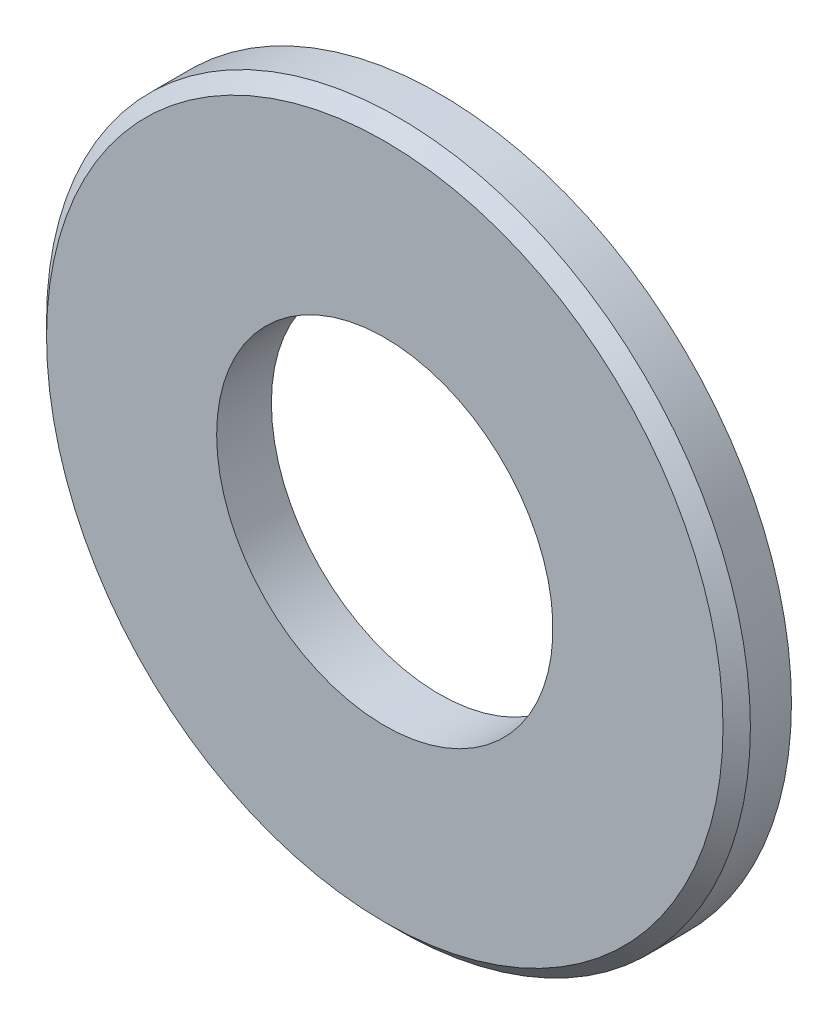
ISO-10303-21;
HEADER;
FILE_DESCRIPTION(('STEP AP214'),'2;1');
FILE_NAME('part.step','',(''),(''),'','','');
FILE_SCHEMA(('AUTOMOTIVE_DESIGN { 1 0 10303 214 1 1 1 1 }'));
ENDSEC;
DATA;
#1=APPLICATION_CONTEXT('core data for automotive mechanical design processes');
#2=APPLICATION_PROTOCOL_DEFINITION('international standard','automotive_design',2000,#1);
#3=PRODUCT_CONTEXT('',#1,'mechanical');
#4=PRODUCT('Part','Part','',(#3));
#5=PRODUCT_RELATED_PRODUCT_CATEGORY('part','',(#4));
#6=PRODUCT_DEFINITION_FORMATION('','',#4);
#7=PRODUCT_DEFINITION_CONTEXT('part definition',#1,'design');
#8=PRODUCT_DEFINITION('design','',#6,#7);
#9=PRODUCT_DEFINITION_SHAPE('','',#8);
#10=(LENGTH_UNIT() NAMED_UNIT(*) SI_UNIT(.MILLI.,.METRE.));
#11=(NAMED_UNIT(*) PLANE_ANGLE_UNIT() SI_UNIT($,.RADIAN.));
#12=(NAMED_UNIT(*) SI_UNIT($,.STERADIAN.) SOLID_ANGLE_UNIT());
#13=UNCERTAINTY_MEASURE_WITH_UNIT(LENGTH_MEASURE(1.E-05),#10,'distance_accuracy_value','');
#14=(GEOMETRIC_REPRESENTATION_CONTEXT(3) GLOBAL_UNCERTAINTY_ASSIGNED_CONTEXT((#13)) GLOBAL_UNIT_ASSIGNED_CONTEXT((#10,
#11,#12)) REPRESENTATION_CONTEXT('',''));
#15=CARTESIAN_POINT('',(0.,0.,0.));
#16=DIRECTION('',(0.,0.,1.));
#17=DIRECTION('',(1.,0.,0.));
#18=AXIS2_PLACEMENT_3D('',#15,#16,#17);
#19=CARTESIAN_POINT('',(0.,0.,0.175));
#20=DIRECTION('',(0.,0.,-1.));
#21=DIRECTION('',(-1.,0.,0.));
#22=AXIS2_PLACEMENT_3D('',#19,#20,#21);
#23=CONICAL_SURFACE('',#22,4.5,0.785398163397448);
#24=CARTESIAN_POINT('',(0.,0.,0.175));
#25=DIRECTION('',(0.,0.,-1.));
#26=DIRECTION('',(-1.,0.,0.));
#27=AXIS2_PLACEMENT_3D('',#24,#25,#26);
#28=CIRCLE('',#27,4.5);
#29=CARTESIAN_POINT('',(-4.5,0.,0.175));
#30=VERTEX_POINT('',#29);
#31=EDGE_CURVE('E11',#30,#30,#28,.T.);
#32=ORIENTED_EDGE('',*,*,#31,.F.);
#33=EDGE_LOOP('',(#32));
#34=FACE_BOUND('',#33,.T.);
#35=CARTESIAN_POINT('',(0.,0.,0.35));
#36=DIRECTION('',(0.,0.,-1.));
#37=DIRECTION('',(-1.,0.,0.));
#38=AXIS2_PLACEMENT_3D('',#35,#36,#37);
#39=CIRCLE('',#38,4.325);
#40=CARTESIAN_POINT('',(-4.325,0.,0.35));
#41=VERTEX_POINT('',#40);
#42=EDGE_CURVE('E54',#41,#41,#39,.T.);
#43=ORIENTED_EDGE('',*,*,#42,.T.);
#44=EDGE_LOOP('',(#43));
#45=FACE_BOUND('',#44,.T.);
#46=ADVANCED_FACE('F17',(#34,#45),#23,.T.);
#47=CARTESIAN_POINT('',(0.,0.,2.85761549265734));
#48=DIRECTION('',(0.,0.,-1.));
#49=DIRECTION('',(-1.,0.,0.));
#50=AXIS2_PLACEMENT_3D('',#47,#48,#49);
#51=CYLINDRICAL_SURFACE('',#50,4.5);
#52=ORIENTED_EDGE('',*,*,#31,.T.);
#53=EDGE_LOOP('',(#52));
#54=FACE_BOUND('',#53,.T.);
#55=CARTESIAN_POINT('',(0.,0.,-0.35));
#56=DIRECTION('',(0.,0.,-1.));
#57=DIRECTION('',(-1.,0.,0.));
#58=AXIS2_PLACEMENT_3D('',#55,#56,#57);
#59=CIRCLE('',#58,4.5);
#60=CARTESIAN_POINT('',(-4.5,0.,-0.35));
#61=VERTEX_POINT('',#60);
#62=EDGE_CURVE('E25',#61,#61,#59,.T.);
#63=ORIENTED_EDGE('',*,*,#62,.F.);
#64=EDGE_LOOP('',(#63));
#65=FACE_BOUND('',#64,.T.);
#66=ADVANCED_FACE('F112',(#54,#65),#51,.T.);
#67=CARTESIAN_POINT('',(3.325,0.,-0.35));
#68=DIRECTION('',(0.,0.,-1.));
#69=DIRECTION('',(0.,-1.,0.));
#70=AXIS2_PLACEMENT_3D('',#67,#68,#69);
#71=PLANE('',#70);
#72=CARTESIAN_POINT('',(0.,0.,-0.35));
#73=DIRECTION('',(0.,0.,-1.));
#74=DIRECTION('',(-1.,0.,0.));
#75=AXIS2_PLACEMENT_3D('',#72,#73,#74);
#76=CIRCLE('',#75,2.15);
#77=CARTESIAN_POINT('',(-2.15,0.,-0.35));
#78=VERTEX_POINT('',#77);
#79=EDGE_CURVE('E63',#78,#78,#76,.T.);
#80=ORIENTED_EDGE('',*,*,#79,.F.);
#81=EDGE_LOOP('',(#80));
#82=FACE_BOUND('',#81,.T.);
#83=ORIENTED_EDGE('',*,*,#62,.T.);
#84=EDGE_LOOP('',(#83));
#85=FACE_BOUND('',#84,.T.);
#86=ADVANCED_FACE('F102',(#82,#85),#71,.T.);
#87=CARTESIAN_POINT('',(0.,0.,2.85761549265734));
#88=DIRECTION('',(0.,0.,-1.));
#89=DIRECTION('',(-1.,0.,0.));
#90=AXIS2_PLACEMENT_3D('',#87,#88,#89);
#91=CYLINDRICAL_SURFACE('',#90,2.15);
#92=CARTESIAN_POINT('',(0.,0.,0.35));
#93=DIRECTION('',(0.,0.,-1.));
#94=DIRECTION('',(-1.,0.,0.));
#95=AXIS2_PLACEMENT_3D('',#92,#93,#94);
#96=CIRCLE('',#95,2.15);
#97=CARTESIAN_POINT('',(-2.15,0.,0.35));
#98=VERTEX_POINT('',#97);
#99=EDGE_CURVE('E57',#98,#98,#96,.T.);
#100=ORIENTED_EDGE('',*,*,#99,.F.);
#101=EDGE_LOOP('',(#100));
#102=FACE_BOUND('',#101,.T.);
#103=ORIENTED_EDGE('',*,*,#79,.T.);
#104=EDGE_LOOP('',(#103));
#105=FACE_BOUND('',#104,.T.);
#106=ADVANCED_FACE('F91',(#102,#105),#91,.F.);
#107=CARTESIAN_POINT('',(3.2375,0.,0.35));
#108=DIRECTION('',(0.,0.,-1.));
#109=DIRECTION('',(0.,-1.,0.));
#110=AXIS2_PLACEMENT_3D('',#107,#108,#109);
#111=PLANE('',#110);
#112=ORIENTED_EDGE('',*,*,#99,.T.);
#113=EDGE_LOOP('',(#112));
#114=FACE_BOUND('',#113,.T.);
#115=ORIENTED_EDGE('',*,*,#42,.F.);
#116=EDGE_LOOP('',(#115));
#117=FACE_BOUND('',#116,.T.);
#118=ADVANCED_FACE('F86',(#114,#117),#111,.F.);
#119=CLOSED_SHELL('',(#46,#66,#86,#106,#118));
#120=MANIFOLD_SOLID_BREP('B1',#119);
#121=ADVANCED_BREP_SHAPE_REPRESENTATION('',(#18,#120),#14);
#122=SHAPE_DEFINITION_REPRESENTATION(#9,#121);
ENDSEC;
END-ISO-10303-21;
